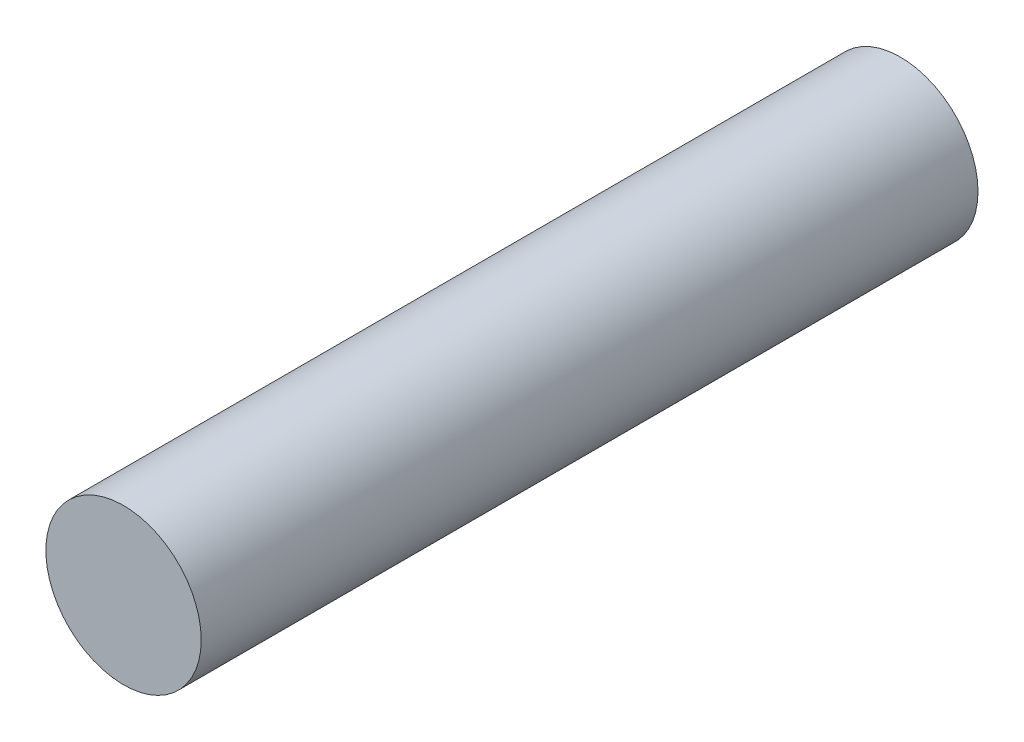
ISO-10303-21;
HEADER;
FILE_DESCRIPTION(('STEP AP214'),'2;1');
FILE_NAME('part.step','',(''),(''),'','','');
FILE_SCHEMA(('AUTOMOTIVE_DESIGN { 1 0 10303 214 1 1 1 1 }'));
ENDSEC;
DATA;
#1=APPLICATION_CONTEXT('core data for automotive mechanical design processes');
#2=APPLICATION_PROTOCOL_DEFINITION('international standard','automotive_design',2000,#1);
#3=PRODUCT_CONTEXT('',#1,'mechanical');
#4=PRODUCT('Part','Part','',(#3));
#5=PRODUCT_RELATED_PRODUCT_CATEGORY('part','',(#4));
#6=PRODUCT_DEFINITION_FORMATION('','',#4);
#7=PRODUCT_DEFINITION_CONTEXT('part definition',#1,'design');
#8=PRODUCT_DEFINITION('design','',#6,#7);
#9=PRODUCT_DEFINITION_SHAPE('','',#8);
#10=(LENGTH_UNIT() NAMED_UNIT(*) SI_UNIT(.MILLI.,.METRE.));
#11=(NAMED_UNIT(*) PLANE_ANGLE_UNIT() SI_UNIT($,.RADIAN.));
#12=(NAMED_UNIT(*) SI_UNIT($,.STERADIAN.) SOLID_ANGLE_UNIT());
#13=UNCERTAINTY_MEASURE_WITH_UNIT(LENGTH_MEASURE(1.E-05),#10,'distance_accuracy_value','');
#14=(GEOMETRIC_REPRESENTATION_CONTEXT(3) GLOBAL_UNCERTAINTY_ASSIGNED_CONTEXT((#13)) GLOBAL_UNIT_ASSIGNED_CONTEXT((#10,
#11,#12)) REPRESENTATION_CONTEXT('',''));
#15=CARTESIAN_POINT('',(0.,0.,0.));
#16=DIRECTION('',(0.,0.,1.));
#17=DIRECTION('',(1.,0.,0.));
#18=AXIS2_PLACEMENT_3D('',#15,#16,#17);
#19=CARTESIAN_POINT('',(0.,0.,18.));
#20=DIRECTION('',(0.,0.,-1.));
#21=DIRECTION('',(-1.,0.,0.));
#22=AXIS2_PLACEMENT_3D('',#19,#20,#21);
#23=CYLINDRICAL_SURFACE('',#22,1.8);
#24=CARTESIAN_POINT('',(0.,0.,18.));
#25=DIRECTION('',(0.,0.,1.));
#26=DIRECTION('',(1.,0.,0.));
#27=AXIS2_PLACEMENT_3D('',#24,#25,#26);
#28=CIRCLE('',#27,1.8);
#29=CARTESIAN_POINT('',(1.8,0.,18.));
#30=VERTEX_POINT('',#29);
#31=EDGE_CURVE('E10',#30,#30,#28,.T.);
#32=ORIENTED_EDGE('',*,*,#31,.F.);
#33=EDGE_LOOP('',(#32));
#34=FACE_BOUND('',#33,.T.);
#35=CARTESIAN_POINT('',(0.,0.,0.));
#36=DIRECTION('',(0.,0.,1.));
#37=DIRECTION('',(1.,0.,0.));
#38=AXIS2_PLACEMENT_3D('',#35,#36,#37);
#39=CIRCLE('',#38,1.8);
#40=CARTESIAN_POINT('',(1.8,0.,0.));
#41=VERTEX_POINT('',#40);
#42=EDGE_CURVE('E36',#41,#41,#39,.T.);
#43=ORIENTED_EDGE('',*,*,#42,.T.);
#44=EDGE_LOOP('',(#43));
#45=FACE_BOUND('',#44,.T.);
#46=ADVANCED_FACE('F33',(#34,#45),#23,.T.);
#47=CARTESIAN_POINT('',(0.,0.,18.));
#48=DIRECTION('',(0.,0.,1.));
#49=DIRECTION('',(1.,0.,0.));
#50=AXIS2_PLACEMENT_3D('',#47,#48,#49);
#51=PLANE('',#50);
#52=ORIENTED_EDGE('',*,*,#31,.T.);
#53=EDGE_LOOP('',(#52));
#54=FACE_BOUND('',#53,.T.);
#55=ADVANCED_FACE('F48',(#54),#51,.T.);
#56=CARTESIAN_POINT('',(0.,0.,0.));
#57=DIRECTION('',(0.,0.,1.));
#58=DIRECTION('',(1.,0.,0.));
#59=AXIS2_PLACEMENT_3D('',#56,#57,#58);
#60=PLANE('',#59);
#61=ORIENTED_EDGE('',*,*,#42,.F.);
#62=EDGE_LOOP('',(#61));
#63=FACE_BOUND('',#62,.T.);
#64=ADVANCED_FACE('F46',(#63),#60,.F.);
#65=CLOSED_SHELL('',(#46,#55,#64));
#66=MANIFOLD_SOLID_BREP('B2',#65);
#67=ADVANCED_BREP_SHAPE_REPRESENTATION('',(#18,#66),#14);
#68=SHAPE_DEFINITION_REPRESENTATION(#9,#67);
ENDSEC;
END-ISO-10303-21;
